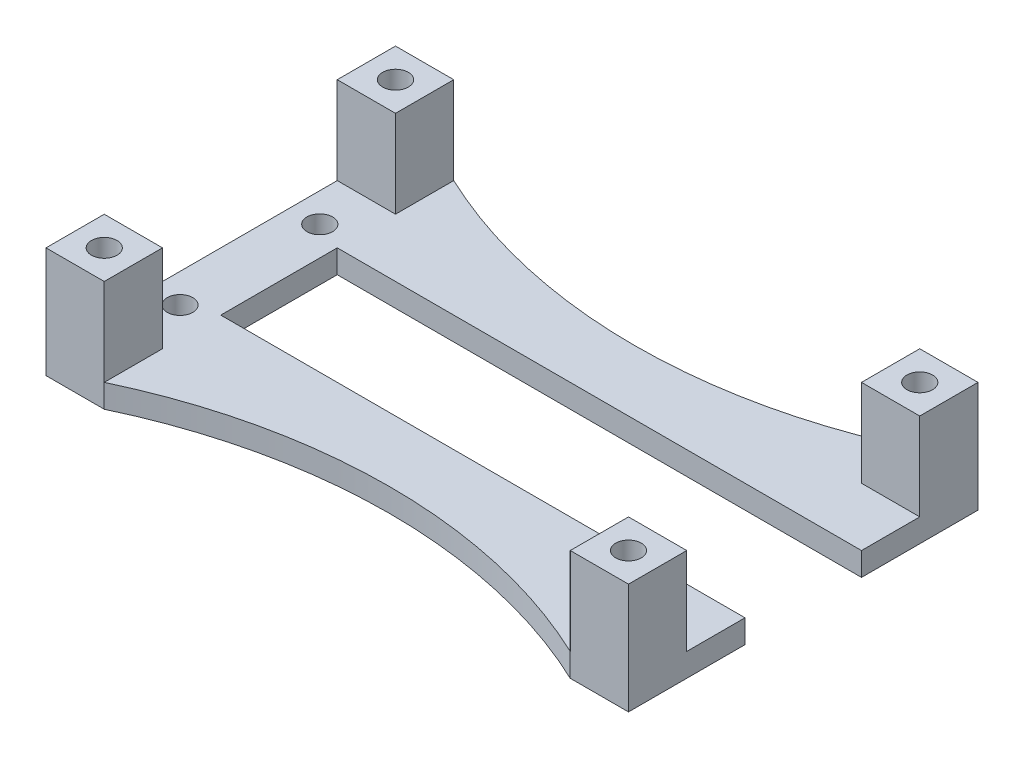
ISO-10303-21;
HEADER;
FILE_DESCRIPTION(('STEP AP214'),'2;1');
FILE_NAME('part.step','',(''),(''),'','','');
FILE_SCHEMA(('AUTOMOTIVE_DESIGN { 1 0 10303 214 1 1 1 1 }'));
ENDSEC;
DATA;
#1=APPLICATION_CONTEXT('core data for automotive mechanical design processes');
#2=APPLICATION_PROTOCOL_DEFINITION('international standard','automotive_design',2000,#1);
#3=PRODUCT_CONTEXT('',#1,'mechanical');
#4=PRODUCT('Part','Part','',(#3));
#5=PRODUCT_RELATED_PRODUCT_CATEGORY('part','',(#4));
#6=PRODUCT_DEFINITION_FORMATION('','',#4);
#7=PRODUCT_DEFINITION_CONTEXT('part definition',#1,'design');
#8=PRODUCT_DEFINITION('design','',#6,#7);
#9=PRODUCT_DEFINITION_SHAPE('','',#8);
#10=(LENGTH_UNIT() NAMED_UNIT(*) SI_UNIT(.MILLI.,.METRE.));
#11=(NAMED_UNIT(*) PLANE_ANGLE_UNIT() SI_UNIT($,.RADIAN.));
#12=(NAMED_UNIT(*) SI_UNIT($,.STERADIAN.) SOLID_ANGLE_UNIT());
#13=UNCERTAINTY_MEASURE_WITH_UNIT(LENGTH_MEASURE(1.E-05),#10,'distance_accuracy_value','');
#14=(GEOMETRIC_REPRESENTATION_CONTEXT(3) GLOBAL_UNCERTAINTY_ASSIGNED_CONTEXT((#13)) GLOBAL_UNIT_ASSIGNED_CONTEXT((#10,
#11,#12)) REPRESENTATION_CONTEXT('',''));
#15=CARTESIAN_POINT('',(0.,0.,0.));
#16=DIRECTION('',(0.,0.,1.));
#17=DIRECTION('',(1.,0.,0.));
#18=AXIS2_PLACEMENT_3D('',#15,#16,#17);
#19=CARTESIAN_POINT('',(95.,4.,25.0000000000001));
#20=DIRECTION('',(0.,-1.,0.));
#21=DIRECTION('',(0.,0.,-1.));
#22=AXIS2_PLACEMENT_3D('',#19,#20,#21);
#23=CYLINDRICAL_SURFACE('',#22,2.2);
#24=CARTESIAN_POINT('',(95.,19.,25.0000000000001));
#25=DIRECTION('',(0.,1.,0.));
#26=DIRECTION('',(0.,0.,1.));
#27=AXIS2_PLACEMENT_3D('',#24,#25,#26);
#28=CIRCLE('',#27,2.2);
#29=CARTESIAN_POINT('',(95.,19.,27.2000000000001));
#30=VERTEX_POINT('',#29);
#31=EDGE_CURVE('E269',#30,#30,#28,.T.);
#32=ORIENTED_EDGE('',*,*,#31,.T.);
#33=EDGE_LOOP('',(#32));
#34=FACE_BOUND('',#33,.T.);
#35=CARTESIAN_POINT('',(95.,2.5,25.0000000000001));
#36=DIRECTION('',(0.,-1.,0.));
#37=DIRECTION('',(0.,0.,-1.));
#38=AXIS2_PLACEMENT_3D('',#35,#36,#37);
#39=CIRCLE('',#38,2.2);
#40=CARTESIAN_POINT('',(95.,2.5,22.8000000000001));
#41=VERTEX_POINT('',#40);
#42=EDGE_CURVE('E39',#41,#41,#39,.T.);
#43=ORIENTED_EDGE('',*,*,#42,.T.);
#44=EDGE_LOOP('',(#43));
#45=FACE_BOUND('',#44,.T.);
#46=ADVANCED_FACE('F35',(#34,#45),#23,.F.);
#47=CARTESIAN_POINT('',(5.,4.,-25.));
#48=DIRECTION('',(0.,-1.,0.));
#49=DIRECTION('',(0.,0.,-1.));
#50=AXIS2_PLACEMENT_3D('',#47,#48,#49);
#51=CYLINDRICAL_SURFACE('',#50,2.2);
#52=CARTESIAN_POINT('',(5.,19.,-25.));
#53=DIRECTION('',(0.,1.,0.));
#54=DIRECTION('',(0.,0.,1.));
#55=AXIS2_PLACEMENT_3D('',#52,#53,#54);
#56=CIRCLE('',#55,2.2);
#57=CARTESIAN_POINT('',(5.,19.,-22.8));
#58=VERTEX_POINT('',#57);
#59=EDGE_CURVE('E243',#58,#58,#56,.T.);
#60=ORIENTED_EDGE('',*,*,#59,.T.);
#61=EDGE_LOOP('',(#60));
#62=FACE_BOUND('',#61,.T.);
#63=CARTESIAN_POINT('',(5.,2.5,-25.));
#64=DIRECTION('',(0.,-1.,0.));
#65=DIRECTION('',(0.,0.,-1.));
#66=AXIS2_PLACEMENT_3D('',#63,#64,#65);
#67=CIRCLE('',#66,2.2);
#68=CARTESIAN_POINT('',(5.,2.5,-27.2));
#69=VERTEX_POINT('',#68);
#70=EDGE_CURVE('E388',#69,#69,#67,.T.);
#71=ORIENTED_EDGE('',*,*,#70,.T.);
#72=EDGE_LOOP('',(#71));
#73=FACE_BOUND('',#72,.T.);
#74=ADVANCED_FACE('F498',(#62,#73),#51,.F.);
#75=CARTESIAN_POINT('',(95.,4.,-25.));
#76=DIRECTION('',(0.,-1.,0.));
#77=DIRECTION('',(0.,0.,-1.));
#78=AXIS2_PLACEMENT_3D('',#75,#76,#77);
#79=CYLINDRICAL_SURFACE('',#78,2.2);
#80=CARTESIAN_POINT('',(95.,19.,-25.));
#81=DIRECTION('',(0.,1.,0.));
#82=DIRECTION('',(0.,0.,1.));
#83=AXIS2_PLACEMENT_3D('',#80,#81,#82);
#84=CIRCLE('',#83,2.20000000000001);
#85=CARTESIAN_POINT('',(95.,19.,-22.8));
#86=VERTEX_POINT('',#85);
#87=EDGE_CURVE('E393',#86,#86,#84,.T.);
#88=ORIENTED_EDGE('',*,*,#87,.T.);
#89=EDGE_LOOP('',(#88));
#90=FACE_BOUND('',#89,.T.);
#91=CARTESIAN_POINT('',(95.,2.5,-25.));
#92=DIRECTION('',(0.,-1.,0.));
#93=DIRECTION('',(0.,0.,-1.));
#94=AXIS2_PLACEMENT_3D('',#91,#92,#93);
#95=CIRCLE('',#94,2.2);
#96=CARTESIAN_POINT('',(95.,2.5,-27.2));
#97=VERTEX_POINT('',#96);
#98=EDGE_CURVE('E385',#97,#97,#95,.T.);
#99=ORIENTED_EDGE('',*,*,#98,.T.);
#100=EDGE_LOOP('',(#99));
#101=FACE_BOUND('',#100,.T.);
#102=ADVANCED_FACE('F503',(#90,#101),#79,.F.);
#103=CARTESIAN_POINT('',(5.,4.,25.));
#104=DIRECTION('',(0.,-1.,0.));
#105=DIRECTION('',(0.,0.,-1.));
#106=AXIS2_PLACEMENT_3D('',#103,#104,#105);
#107=CYLINDRICAL_SURFACE('',#106,2.2);
#108=CARTESIAN_POINT('',(5.,19.,25.));
#109=DIRECTION('',(0.,1.,0.));
#110=DIRECTION('',(0.,0.,1.));
#111=AXIS2_PLACEMENT_3D('',#108,#109,#110);
#112=CIRCLE('',#111,2.2);
#113=CARTESIAN_POINT('',(5.,19.,27.2));
#114=VERTEX_POINT('',#113);
#115=EDGE_CURVE('E208',#114,#114,#112,.T.);
#116=ORIENTED_EDGE('',*,*,#115,.T.);
#117=EDGE_LOOP('',(#116));
#118=FACE_BOUND('',#117,.T.);
#119=CARTESIAN_POINT('',(5.,2.5,25.));
#120=DIRECTION('',(0.,-1.,0.));
#121=DIRECTION('',(0.,0.,-1.));
#122=AXIS2_PLACEMENT_3D('',#119,#120,#121);
#123=CIRCLE('',#122,2.2);
#124=CARTESIAN_POINT('',(5.,2.5,22.8));
#125=VERTEX_POINT('',#124);
#126=EDGE_CURVE('E382',#125,#125,#123,.T.);
#127=ORIENTED_EDGE('',*,*,#126,.T.);
#128=EDGE_LOOP('',(#127));
#129=FACE_BOUND('',#128,.T.);
#130=ADVANCED_FACE('F507',(#118,#129),#107,.F.);
#131=CARTESIAN_POINT('',(0.,4.,0.));
#132=DIRECTION('',(0.,1.,0.));
#133=DIRECTION('',(0.,0.,1.));
#134=AXIS2_PLACEMENT_3D('',#131,#132,#133);
#135=PLANE('',#134);
#136=CARTESIAN_POINT('',(5.,4.,-12.));
#137=DIRECTION('',(0.,1.,0.));
#138=DIRECTION('',(0.,0.,1.));
#139=AXIS2_PLACEMENT_3D('',#136,#137,#138);
#140=CIRCLE('',#139,2.2);
#141=CARTESIAN_POINT('',(5.,4.,-9.8));
#142=VERTEX_POINT('',#141);
#143=EDGE_CURVE('E320',#142,#142,#140,.F.);
#144=ORIENTED_EDGE('',*,*,#143,.T.);
#145=EDGE_LOOP('',(#144));
#146=FACE_BOUND('',#145,.T.);
#147=CARTESIAN_POINT('',(5.,4.,12.));
#148=DIRECTION('',(0.,1.,0.));
#149=DIRECTION('',(0.,0.,1.));
#150=AXIS2_PLACEMENT_3D('',#147,#148,#149);
#151=CIRCLE('',#150,2.2);
#152=CARTESIAN_POINT('',(5.,4.,14.2));
#153=VERTEX_POINT('',#152);
#154=EDGE_CURVE('E317',#153,#153,#151,.T.);
#155=ORIENTED_EDGE('',*,*,#154,.F.);
#156=EDGE_LOOP('',(#155));
#157=FACE_BOUND('',#156,.T.);
#158=DIRECTION('',(0.,0.,-1.));
#159=VECTOR('',#158,1.);
#160=CARTESIAN_POINT('',(100.,4.,-2.77555756156289E-13));
#161=LINE('',#160,#159);
#162=CARTESIAN_POINT('',(100.,4.,-10.));
#163=VERTEX_POINT('',#162);
#164=CARTESIAN_POINT('',(100.,4.,-20.));
#165=VERTEX_POINT('',#164);
#166=EDGE_CURVE('E57',#163,#165,#161,.T.);
#167=ORIENTED_EDGE('',*,*,#166,.T.);
#168=DIRECTION('',(1.,0.,0.));
#169=VECTOR('',#168,1.);
#170=CARTESIAN_POINT('',(90.,4.,-20.));
#171=LINE('',#170,#169);
#172=CARTESIAN_POINT('',(90.,4.,-20.));
#173=VERTEX_POINT('',#172);
#174=EDGE_CURVE('E52',#173,#165,#171,.T.);
#175=ORIENTED_EDGE('',*,*,#174,.F.);
#176=DIRECTION('',(0.,0.,1.));
#177=VECTOR('',#176,1.);
#178=CARTESIAN_POINT('',(90.,4.,-30.));
#179=LINE('',#178,#177);
#180=CARTESIAN_POINT('',(90.,4.,-30.));
#181=VERTEX_POINT('',#180);
#182=EDGE_CURVE('E205',#181,#173,#179,.T.);
#183=ORIENTED_EDGE('',*,*,#182,.F.);
#184=CARTESIAN_POINT('',(50.,4.,-114.388888888889));
#185=DIRECTION('',(0.,1.,0.));
#186=DIRECTION('',(0.,0.,1.));
#187=AXIS2_PLACEMENT_3D('',#184,#185,#186);
#188=CIRCLE('',#187,93.388888888889);
#189=CARTESIAN_POINT('',(10.,4.,-30.));
#190=VERTEX_POINT('',#189);
#191=EDGE_CURVE('E315',#190,#181,#188,.T.);
#192=ORIENTED_EDGE('',*,*,#191,.F.);
#193=DIRECTION('',(0.,0.,-1.));
#194=VECTOR('',#193,1.);
#195=CARTESIAN_POINT('',(10.,4.,-20.));
#196=LINE('',#195,#194);
#197=CARTESIAN_POINT('',(10.,4.,-20.));
#198=VERTEX_POINT('',#197);
#199=EDGE_CURVE('E251',#198,#190,#196,.T.);
#200=ORIENTED_EDGE('',*,*,#199,.F.);
#201=DIRECTION('',(1.,0.,0.));
#202=VECTOR('',#201,1.);
#203=CARTESIAN_POINT('',(0.,4.,-20.));
#204=LINE('',#203,#202);
#205=CARTESIAN_POINT('',(0.,4.,-20.));
#206=VERTEX_POINT('',#205);
#207=EDGE_CURVE('E246',#206,#198,#204,.T.);
#208=ORIENTED_EDGE('',*,*,#207,.F.);
#209=DIRECTION('',(0.,0.,-1.));
#210=VECTOR('',#209,1.);
#211=CARTESIAN_POINT('',(0.,4.,0.));
#212=LINE('',#211,#210);
#213=CARTESIAN_POINT('',(0.,4.,20.));
#214=VERTEX_POINT('',#213);
#215=EDGE_CURVE('E298',#214,#206,#212,.T.);
#216=ORIENTED_EDGE('',*,*,#215,.F.);
#217=DIRECTION('',(-1.,0.,0.));
#218=VECTOR('',#217,1.);
#219=CARTESIAN_POINT('',(10.,4.,20.));
#220=LINE('',#219,#218);
#221=CARTESIAN_POINT('',(10.,4.,20.));
#222=VERTEX_POINT('',#221);
#223=EDGE_CURVE('E223',#222,#214,#220,.T.);
#224=ORIENTED_EDGE('',*,*,#223,.F.);
#225=DIRECTION('',(0.,0.,-1.));
#226=VECTOR('',#225,1.);
#227=CARTESIAN_POINT('',(10.,4.,30.));
#228=LINE('',#227,#226);
#229=CARTESIAN_POINT('',(10.,4.,30.));
#230=VERTEX_POINT('',#229);
#231=EDGE_CURVE('E212',#230,#222,#228,.T.);
#232=ORIENTED_EDGE('',*,*,#231,.F.);
#233=CARTESIAN_POINT('',(50.,4.,114.388888888889));
#234=DIRECTION('',(0.,1.,0.));
#235=DIRECTION('',(0.,0.,1.));
#236=AXIS2_PLACEMENT_3D('',#233,#234,#235);
#237=CIRCLE('',#236,93.3888888888889);
#238=CARTESIAN_POINT('',(90.,4.,30.));
#239=VERTEX_POINT('',#238);
#240=EDGE_CURVE('E300',#239,#230,#237,.T.);
#241=ORIENTED_EDGE('',*,*,#240,.F.);
#242=DIRECTION('',(0.,0.,1.));
#243=VECTOR('',#242,1.);
#244=CARTESIAN_POINT('',(90.,4.,30.0000000000001));
#245=LINE('',#244,#243);
#246=CARTESIAN_POINT('',(90.,4.,20.0000000000001));
#247=VERTEX_POINT('',#246);
#248=EDGE_CURVE('E272',#247,#239,#245,.T.);
#249=ORIENTED_EDGE('',*,*,#248,.F.);
#250=DIRECTION('',(-1.,0.,0.));
#251=VECTOR('',#250,1.);
#252=CARTESIAN_POINT('',(90.,4.,20.0000000000001));
#253=LINE('',#252,#251);
#254=CARTESIAN_POINT('',(100.,4.,20.0000000000001));
#255=VERTEX_POINT('',#254);
#256=EDGE_CURVE('E277',#255,#247,#253,.T.);
#257=ORIENTED_EDGE('',*,*,#256,.F.);
#258=DIRECTION('',(0.,0.,-1.));
#259=VECTOR('',#258,1.);
#260=CARTESIAN_POINT('',(100.,4.,1.38777878078145E-13));
#261=LINE('',#260,#259);
#262=CARTESIAN_POINT('',(100.,4.,10.));
#263=VERTEX_POINT('',#262);
#264=EDGE_CURVE('E303',#255,#263,#261,.T.);
#265=ORIENTED_EDGE('',*,*,#264,.T.);
#266=DIRECTION('',(1.,0.,0.));
#267=VECTOR('',#266,1.);
#268=CARTESIAN_POINT('',(0.,4.,9.99999999999988));
#269=LINE('',#268,#267);
#270=CARTESIAN_POINT('',(10.,4.,10.));
#271=VERTEX_POINT('',#270);
#272=EDGE_CURVE('E305',#271,#263,#269,.T.);
#273=ORIENTED_EDGE('',*,*,#272,.F.);
#274=DIRECTION('',(0.,0.,1.));
#275=VECTOR('',#274,1.);
#276=CARTESIAN_POINT('',(10.,4.,0.));
#277=LINE('',#276,#275);
#278=CARTESIAN_POINT('',(10.,4.,-9.99999999999999));
#279=VERTEX_POINT('',#278);
#280=EDGE_CURVE('E308',#279,#271,#277,.T.);
#281=ORIENTED_EDGE('',*,*,#280,.F.);
#282=DIRECTION('',(-1.,0.,0.));
#283=VECTOR('',#282,1.);
#284=CARTESIAN_POINT('',(0.,4.,-9.99999999999999));
#285=LINE('',#284,#283);
#286=EDGE_CURVE('E311',#163,#279,#285,.T.);
#287=ORIENTED_EDGE('',*,*,#286,.F.);
#288=EDGE_LOOP('',(#167,#175,#183,#192,#200,#208,#216,#224,#232,#241,#249,#257,#265,#273,#281,#287));
#289=FACE_BOUND('',#288,.T.);
#290=ADVANCED_FACE('F411',(#146,#157,#289),#135,.T.);
#291=CARTESIAN_POINT('',(0.,4.,0.));
#292=DIRECTION('',(-1.,0.,0.));
#293=DIRECTION('',(0.,0.,1.));
#294=AXIS2_PLACEMENT_3D('',#291,#292,#293);
#295=PLANE('',#294);
#296=DIRECTION('',(0.,0.,-1.));
#297=VECTOR('',#296,1.);
#298=CARTESIAN_POINT('',(0.,0.,0.));
#299=LINE('',#298,#297);
#300=CARTESIAN_POINT('',(0.,0.,30.));
#301=VERTEX_POINT('',#300);
#302=CARTESIAN_POINT('',(0.,0.,-30.));
#303=VERTEX_POINT('',#302);
#304=EDGE_CURVE('E297',#301,#303,#299,.T.);
#305=ORIENTED_EDGE('',*,*,#304,.F.);
#306=DIRECTION('',(0.,-1.,0.));
#307=VECTOR('',#306,1.);
#308=CARTESIAN_POINT('',(0.,4.,30.));
#309=LINE('',#308,#307);
#310=CARTESIAN_POINT('',(0.,19.,30.));
#311=VERTEX_POINT('',#310);
#312=EDGE_CURVE('E11',#311,#301,#309,.T.);
#313=ORIENTED_EDGE('',*,*,#312,.F.);
#314=DIRECTION('',(0.,0.,1.));
#315=VECTOR('',#314,1.);
#316=CARTESIAN_POINT('',(0.,19.,20.));
#317=LINE('',#316,#315);
#318=CARTESIAN_POINT('',(0.,19.,20.));
#319=VERTEX_POINT('',#318);
#320=EDGE_CURVE('E225',#319,#311,#317,.T.);
#321=ORIENTED_EDGE('',*,*,#320,.F.);
#322=DIRECTION('',(0.,-1.,0.));
#323=VECTOR('',#322,1.);
#324=CARTESIAN_POINT('',(0.,19.,20.));
#325=LINE('',#324,#323);
#326=EDGE_CURVE('E237',#319,#214,#325,.T.);
#327=ORIENTED_EDGE('',*,*,#326,.T.);
#328=ORIENTED_EDGE('',*,*,#215,.T.);
#329=DIRECTION('',(0.,-1.,0.));
#330=VECTOR('',#329,1.);
#331=CARTESIAN_POINT('',(0.,19.,-20.));
#332=LINE('',#331,#330);
#333=CARTESIAN_POINT('',(0.,19.,-20.));
#334=VERTEX_POINT('',#333);
#335=EDGE_CURVE('E258',#334,#206,#332,.T.);
#336=ORIENTED_EDGE('',*,*,#335,.F.);
#337=DIRECTION('',(0.,0.,1.));
#338=VECTOR('',#337,1.);
#339=CARTESIAN_POINT('',(0.,19.,-30.));
#340=LINE('',#339,#338);
#341=CARTESIAN_POINT('',(0.,19.,-30.));
#342=VERTEX_POINT('',#341);
#343=EDGE_CURVE('E256',#342,#334,#340,.T.);
#344=ORIENTED_EDGE('',*,*,#343,.F.);
#345=DIRECTION('',(0.,-1.,0.));
#346=VECTOR('',#345,1.);
#347=CARTESIAN_POINT('',(0.,4.,-30.));
#348=LINE('',#347,#346);
#349=EDGE_CURVE('E323',#342,#303,#348,.T.);
#350=ORIENTED_EDGE('',*,*,#349,.T.);
#351=EDGE_LOOP('',(#305,#313,#321,#327,#328,#336,#344,#350));
#352=FACE_BOUND('',#351,.T.);
#353=ADVANCED_FACE('F37',(#352),#295,.T.);
#354=CARTESIAN_POINT('',(0.,4.,30.));
#355=DIRECTION('',(0.,0.,-1.));
#356=DIRECTION('',(-1.,0.,0.));
#357=AXIS2_PLACEMENT_3D('',#354,#355,#356);
#358=PLANE('',#357);
#359=DIRECTION('',(1.,0.,0.));
#360=VECTOR('',#359,1.);
#361=CARTESIAN_POINT('',(0.,0.,30.));
#362=LINE('',#361,#360);
#363=CARTESIAN_POINT('',(10.,0.,30.));
#364=VERTEX_POINT('',#363);
#365=EDGE_CURVE('E326',#301,#364,#362,.T.);
#366=ORIENTED_EDGE('',*,*,#365,.T.);
#367=DIRECTION('',(0.,-1.,0.));
#368=VECTOR('',#367,1.);
#369=CARTESIAN_POINT('',(10.,4.,30.));
#370=LINE('',#369,#368);
#371=EDGE_CURVE('E44',#230,#364,#370,.T.);
#372=ORIENTED_EDGE('',*,*,#371,.F.);
#373=DIRECTION('',(0.,-1.,0.));
#374=VECTOR('',#373,1.);
#375=CARTESIAN_POINT('',(10.,19.,30.));
#376=LINE('',#375,#374);
#377=CARTESIAN_POINT('',(10.,19.,30.));
#378=VERTEX_POINT('',#377);
#379=EDGE_CURVE('E230',#378,#230,#376,.T.);
#380=ORIENTED_EDGE('',*,*,#379,.F.);
#381=DIRECTION('',(1.,0.,0.));
#382=VECTOR('',#381,1.);
#383=CARTESIAN_POINT('',(0.,19.,30.));
#384=LINE('',#383,#382);
#385=EDGE_CURVE('E228',#311,#378,#384,.T.);
#386=ORIENTED_EDGE('',*,*,#385,.F.);
#387=ORIENTED_EDGE('',*,*,#312,.T.);
#388=EDGE_LOOP('',(#366,#372,#380,#386,#387));
#389=FACE_BOUND('',#388,.T.);
#390=ADVANCED_FACE('F453',(#389),#358,.F.);
#391=CARTESIAN_POINT('',(50.,4.,114.388888888889));
#392=DIRECTION('',(0.,-1.,0.));
#393=DIRECTION('',(0.,0.,-1.));
#394=AXIS2_PLACEMENT_3D('',#391,#392,#393);
#395=CYLINDRICAL_SURFACE('',#394,93.3888888888889);
#396=CARTESIAN_POINT('',(50.,0.,114.388888888889));
#397=DIRECTION('',(0.,1.,0.));
#398=DIRECTION('',(0.,0.,1.));
#399=AXIS2_PLACEMENT_3D('',#396,#397,#398);
#400=CIRCLE('',#399,93.3888888888889);
#401=CARTESIAN_POINT('',(90.,0.,30.));
#402=VERTEX_POINT('',#401);
#403=EDGE_CURVE('E329',#402,#364,#400,.T.);
#404=ORIENTED_EDGE('',*,*,#403,.F.);
#405=DIRECTION('',(0.,-1.,0.));
#406=VECTOR('',#405,1.);
#407=CARTESIAN_POINT('',(90.,4.,30.));
#408=LINE('',#407,#406);
#409=EDGE_CURVE('E379',#239,#402,#408,.T.);
#410=ORIENTED_EDGE('',*,*,#409,.F.);
#411=ORIENTED_EDGE('',*,*,#240,.T.);
#412=ORIENTED_EDGE('',*,*,#371,.T.);
#413=EDGE_LOOP('',(#404,#410,#411,#412));
#414=FACE_BOUND('',#413,.T.);
#415=ADVANCED_FACE('F538',(#414),#395,.F.);
#416=CARTESIAN_POINT('',(-3.74700270810977E-13,4.,29.9999999999989));
#417=DIRECTION('',(0.,0.,1.));
#418=DIRECTION('',(1.,0.,0.));
#419=AXIS2_PLACEMENT_3D('',#416,#417,#418);
#420=PLANE('',#419);
#421=DIRECTION('',(-1.,0.,0.));
#422=VECTOR('',#421,1.);
#423=CARTESIAN_POINT('',(-3.74700270810977E-13,0.,29.9999999999989));
#424=LINE('',#423,#422);
#425=CARTESIAN_POINT('',(100.,0.,30.0000000000001));
#426=VERTEX_POINT('',#425);
#427=EDGE_CURVE('E332',#426,#402,#424,.T.);
#428=ORIENTED_EDGE('',*,*,#427,.F.);
#429=DIRECTION('',(0.,-1.,0.));
#430=VECTOR('',#429,1.);
#431=CARTESIAN_POINT('',(100.,4.,30.0000000000001));
#432=LINE('',#431,#430);
#433=CARTESIAN_POINT('',(100.,19.,30.0000000000001));
#434=VERTEX_POINT('',#433);
#435=EDGE_CURVE('E377',#434,#426,#432,.T.);
#436=ORIENTED_EDGE('',*,*,#435,.F.);
#437=DIRECTION('',(1.,0.,0.));
#438=VECTOR('',#437,1.);
#439=CARTESIAN_POINT('',(100.,19.,30.0000000000001));
#440=LINE('',#439,#438);
#441=CARTESIAN_POINT('',(90.,19.,30.0000000000001));
#442=VERTEX_POINT('',#441);
#443=EDGE_CURVE('E276',#442,#434,#440,.T.);
#444=ORIENTED_EDGE('',*,*,#443,.F.);
#445=DIRECTION('',(0.,-1.,0.));
#446=VECTOR('',#445,1.);
#447=CARTESIAN_POINT('',(90.,19.,30.0000000000001));
#448=LINE('',#447,#446);
#449=EDGE_CURVE('E294',#442,#239,#448,.T.);
#450=ORIENTED_EDGE('',*,*,#449,.T.);
#451=ORIENTED_EDGE('',*,*,#409,.T.);
#452=EDGE_LOOP('',(#428,#436,#444,#450,#451));
#453=FACE_BOUND('',#452,.T.);
#454=ADVANCED_FACE('F463',(#453),#420,.T.);
#455=CARTESIAN_POINT('',(100.,4.,1.38777878078145E-13));
#456=DIRECTION('',(-1.,0.,0.));
#457=DIRECTION('',(0.,0.,1.));
#458=AXIS2_PLACEMENT_3D('',#455,#456,#457);
#459=PLANE('',#458);
#460=DIRECTION('',(0.,0.,-1.));
#461=VECTOR('',#460,1.);
#462=CARTESIAN_POINT('',(100.,0.,1.38777878078145E-13));
#463=LINE('',#462,#461);
#464=CARTESIAN_POINT('',(100.,0.,10.));
#465=VERTEX_POINT('',#464);
#466=EDGE_CURVE('E335',#426,#465,#463,.T.);
#467=ORIENTED_EDGE('',*,*,#466,.T.);
#468=DIRECTION('',(0.,-1.,0.));
#469=VECTOR('',#468,1.);
#470=CARTESIAN_POINT('',(100.,4.,10.));
#471=LINE('',#470,#469);
#472=EDGE_CURVE('E375',#263,#465,#471,.T.);
#473=ORIENTED_EDGE('',*,*,#472,.F.);
#474=ORIENTED_EDGE('',*,*,#264,.F.);
#475=DIRECTION('',(0.,-1.,0.));
#476=VECTOR('',#475,1.);
#477=CARTESIAN_POINT('',(100.,19.,20.0000000000001));
#478=LINE('',#477,#476);
#479=CARTESIAN_POINT('',(100.,19.,20.0000000000001));
#480=VERTEX_POINT('',#479);
#481=EDGE_CURVE('E291',#480,#255,#478,.T.);
#482=ORIENTED_EDGE('',*,*,#481,.F.);
#483=DIRECTION('',(0.,0.,-1.));
#484=VECTOR('',#483,1.);
#485=CARTESIAN_POINT('',(100.,19.,20.0000000000001));
#486=LINE('',#485,#484);
#487=EDGE_CURVE('E280',#434,#480,#486,.T.);
#488=ORIENTED_EDGE('',*,*,#487,.F.);
#489=ORIENTED_EDGE('',*,*,#435,.T.);
#490=EDGE_LOOP('',(#467,#473,#474,#482,#488,#489));
#491=FACE_BOUND('',#490,.T.);
#492=ADVANCED_FACE('F477',(#491),#459,.F.);
#493=CARTESIAN_POINT('',(0.,4.,9.99999999999988));
#494=DIRECTION('',(0.,0.,-1.));
#495=DIRECTION('',(-1.,0.,0.));
#496=AXIS2_PLACEMENT_3D('',#493,#494,#495);
#497=PLANE('',#496);
#498=DIRECTION('',(1.,0.,0.));
#499=VECTOR('',#498,1.);
#500=CARTESIAN_POINT('',(0.,0.,9.99999999999988));
#501=LINE('',#500,#499);
#502=CARTESIAN_POINT('',(10.,0.,10.));
#503=VERTEX_POINT('',#502);
#504=EDGE_CURVE('E338',#503,#465,#501,.T.);
#505=ORIENTED_EDGE('',*,*,#504,.F.);
#506=DIRECTION('',(0.,-1.,0.));
#507=VECTOR('',#506,1.);
#508=CARTESIAN_POINT('',(10.,4.,10.));
#509=LINE('',#508,#507);
#510=EDGE_CURVE('E373',#271,#503,#509,.T.);
#511=ORIENTED_EDGE('',*,*,#510,.F.);
#512=ORIENTED_EDGE('',*,*,#272,.T.);
#513=ORIENTED_EDGE('',*,*,#472,.T.);
#514=EDGE_LOOP('',(#505,#511,#512,#513));
#515=FACE_BOUND('',#514,.T.);
#516=ADVANCED_FACE('F482',(#515),#497,.T.);
#517=CARTESIAN_POINT('',(10.,4.,0.));
#518=DIRECTION('',(1.,0.,0.));
#519=DIRECTION('',(0.,0.,-1.));
#520=AXIS2_PLACEMENT_3D('',#517,#518,#519);
#521=PLANE('',#520);
#522=DIRECTION('',(0.,0.,1.));
#523=VECTOR('',#522,1.);
#524=CARTESIAN_POINT('',(10.,0.,0.));
#525=LINE('',#524,#523);
#526=CARTESIAN_POINT('',(10.,0.,-9.99999999999999));
#527=VERTEX_POINT('',#526);
#528=EDGE_CURVE('E341',#527,#503,#525,.T.);
#529=ORIENTED_EDGE('',*,*,#528,.F.);
#530=DIRECTION('',(0.,-1.,0.));
#531=VECTOR('',#530,1.);
#532=CARTESIAN_POINT('',(10.,4.,-9.99999999999999));
#533=LINE('',#532,#531);
#534=EDGE_CURVE('E371',#279,#527,#533,.T.);
#535=ORIENTED_EDGE('',*,*,#534,.F.);
#536=ORIENTED_EDGE('',*,*,#280,.T.);
#537=ORIENTED_EDGE('',*,*,#510,.T.);
#538=EDGE_LOOP('',(#529,#535,#536,#537));
#539=FACE_BOUND('',#538,.T.);
#540=ADVANCED_FACE('F486',(#539),#521,.T.);
#541=CARTESIAN_POINT('',(0.,4.,-9.99999999999999));
#542=DIRECTION('',(0.,0.,1.));
#543=DIRECTION('',(1.,0.,0.));
#544=AXIS2_PLACEMENT_3D('',#541,#542,#543);
#545=PLANE('',#544);
#546=DIRECTION('',(-1.,0.,0.));
#547=VECTOR('',#546,1.);
#548=CARTESIAN_POINT('',(0.,0.,-9.99999999999999));
#549=LINE('',#548,#547);
#550=CARTESIAN_POINT('',(100.,0.,-10.));
#551=VERTEX_POINT('',#550);
#552=EDGE_CURVE('E344',#551,#527,#549,.T.);
#553=ORIENTED_EDGE('',*,*,#552,.F.);
#554=DIRECTION('',(0.,-1.,0.));
#555=VECTOR('',#554,1.);
#556=CARTESIAN_POINT('',(100.,4.,-10.));
#557=LINE('',#556,#555);
#558=EDGE_CURVE('E369',#163,#551,#557,.T.);
#559=ORIENTED_EDGE('',*,*,#558,.F.);
#560=ORIENTED_EDGE('',*,*,#286,.T.);
#561=ORIENTED_EDGE('',*,*,#534,.T.);
#562=EDGE_LOOP('',(#553,#559,#560,#561));
#563=FACE_BOUND('',#562,.T.);
#564=ADVANCED_FACE('F489',(#563),#545,.T.);
#565=CARTESIAN_POINT('',(100.,4.,-2.77555756156289E-13));
#566=DIRECTION('',(-1.,0.,0.));
#567=DIRECTION('',(0.,0.,1.));
#568=AXIS2_PLACEMENT_3D('',#565,#566,#567);
#569=PLANE('',#568);
#570=DIRECTION('',(0.,0.,-1.));
#571=VECTOR('',#570,1.);
#572=CARTESIAN_POINT('',(100.,0.,-2.77555756156289E-13));
#573=LINE('',#572,#571);
#574=CARTESIAN_POINT('',(100.,0.,-30.));
#575=VERTEX_POINT('',#574);
#576=EDGE_CURVE('E347',#551,#575,#573,.T.);
#577=ORIENTED_EDGE('',*,*,#576,.T.);
#578=DIRECTION('',(0.,-1.,0.));
#579=VECTOR('',#578,1.);
#580=CARTESIAN_POINT('',(100.,4.,-30.));
#581=LINE('',#580,#579);
#582=CARTESIAN_POINT('',(100.,19.,-30.));
#583=VERTEX_POINT('',#582);
#584=EDGE_CURVE('E191',#583,#575,#581,.T.);
#585=ORIENTED_EDGE('',*,*,#584,.F.);
#586=DIRECTION('',(0.,0.,-1.));
#587=VECTOR('',#586,1.);
#588=CARTESIAN_POINT('',(100.,19.,-20.));
#589=LINE('',#588,#587);
#590=CARTESIAN_POINT('',(100.,19.,-20.));
#591=VERTEX_POINT('',#590);
#592=EDGE_CURVE('E185',#591,#583,#589,.T.);
#593=ORIENTED_EDGE('',*,*,#592,.F.);
#594=DIRECTION('',(0.,-1.,0.));
#595=VECTOR('',#594,1.);
#596=CARTESIAN_POINT('',(100.,19.,-20.));
#597=LINE('',#596,#595);
#598=EDGE_CURVE('E189',#591,#165,#597,.T.);
#599=ORIENTED_EDGE('',*,*,#598,.T.);
#600=ORIENTED_EDGE('',*,*,#166,.F.);
#601=ORIENTED_EDGE('',*,*,#558,.T.);
#602=EDGE_LOOP('',(#577,#585,#593,#599,#600,#601));
#603=FACE_BOUND('',#602,.T.);
#604=ADVANCED_FACE('F187',(#603),#569,.F.);
#605=CARTESIAN_POINT('',(0.,4.,-30.));
#606=DIRECTION('',(0.,0.,1.));
#607=DIRECTION('',(1.,0.,0.));
#608=AXIS2_PLACEMENT_3D('',#605,#606,#607);
#609=PLANE('',#608);
#610=DIRECTION('',(-1.,0.,0.));
#611=VECTOR('',#610,1.);
#612=CARTESIAN_POINT('',(0.,0.,-30.));
#613=LINE('',#612,#611);
#614=CARTESIAN_POINT('',(90.,0.,-30.));
#615=VERTEX_POINT('',#614);
#616=EDGE_CURVE('E349',#575,#615,#613,.T.);
#617=ORIENTED_EDGE('',*,*,#616,.T.);
#618=DIRECTION('',(0.,-1.,0.));
#619=VECTOR('',#618,1.);
#620=CARTESIAN_POINT('',(90.,4.,-30.));
#621=LINE('',#620,#619);
#622=EDGE_CURVE('E366',#181,#615,#621,.T.);
#623=ORIENTED_EDGE('',*,*,#622,.F.);
#624=DIRECTION('',(0.,-1.,0.));
#625=VECTOR('',#624,1.);
#626=CARTESIAN_POINT('',(90.,19.,-30.));
#627=LINE('',#626,#625);
#628=CARTESIAN_POINT('',(90.,19.,-30.));
#629=VERTEX_POINT('',#628);
#630=EDGE_CURVE('E209',#629,#181,#627,.T.);
#631=ORIENTED_EDGE('',*,*,#630,.F.);
#632=DIRECTION('',(-1.,0.,0.));
#633=VECTOR('',#632,1.);
#634=CARTESIAN_POINT('',(100.,19.,-30.));
#635=LINE('',#634,#633);
#636=EDGE_CURVE('E194',#583,#629,#635,.T.);
#637=ORIENTED_EDGE('',*,*,#636,.F.);
#638=ORIENTED_EDGE('',*,*,#584,.T.);
#639=EDGE_LOOP('',(#617,#623,#631,#637,#638));
#640=FACE_BOUND('',#639,.T.);
#641=ADVANCED_FACE('F420',(#640),#609,.F.);
#642=CARTESIAN_POINT('',(50.,4.,-114.388888888889));
#643=DIRECTION('',(0.,-1.,0.));
#644=DIRECTION('',(0.,0.,-1.));
#645=AXIS2_PLACEMENT_3D('',#642,#643,#644);
#646=CYLINDRICAL_SURFACE('',#645,93.388888888889);
#647=CARTESIAN_POINT('',(50.,0.,-114.388888888889));
#648=DIRECTION('',(0.,1.,0.));
#649=DIRECTION('',(0.,0.,1.));
#650=AXIS2_PLACEMENT_3D('',#647,#648,#649);
#651=CIRCLE('',#650,93.388888888889);
#652=CARTESIAN_POINT('',(10.,0.,-30.));
#653=VERTEX_POINT('',#652);
#654=EDGE_CURVE('E352',#653,#615,#651,.T.);
#655=ORIENTED_EDGE('',*,*,#654,.F.);
#656=DIRECTION('',(0.,-1.,0.));
#657=VECTOR('',#656,1.);
#658=CARTESIAN_POINT('',(10.,4.,-30.));
#659=LINE('',#658,#657);
#660=EDGE_CURVE('E364',#190,#653,#659,.T.);
#661=ORIENTED_EDGE('',*,*,#660,.F.);
#662=ORIENTED_EDGE('',*,*,#191,.T.);
#663=ORIENTED_EDGE('',*,*,#622,.T.);
#664=EDGE_LOOP('',(#655,#661,#662,#663));
#665=FACE_BOUND('',#664,.T.);
#666=ADVANCED_FACE('F418',(#665),#646,.F.);
#667=CARTESIAN_POINT('',(5.,4.,-12.));
#668=DIRECTION('',(0.,-1.,0.));
#669=DIRECTION('',(0.,0.,-1.));
#670=AXIS2_PLACEMENT_3D('',#667,#668,#669);
#671=CYLINDRICAL_SURFACE('',#670,2.2);
#672=ORIENTED_EDGE('',*,*,#143,.F.);
#673=EDGE_LOOP('',(#672));
#674=FACE_BOUND('',#673,.T.);
#675=CARTESIAN_POINT('',(5.,0.,-12.));
#676=DIRECTION('',(0.,1.,0.));
#677=DIRECTION('',(0.,0.,1.));
#678=AXIS2_PLACEMENT_3D('',#675,#676,#677);
#679=CIRCLE('',#678,2.2);
#680=CARTESIAN_POINT('',(5.,0.,-9.8));
#681=VERTEX_POINT('',#680);
#682=EDGE_CURVE('E301',#681,#681,#679,.F.);
#683=ORIENTED_EDGE('',*,*,#682,.T.);
#684=EDGE_LOOP('',(#683));
#685=FACE_BOUND('',#684,.T.);
#686=ADVANCED_FACE('F512',(#674,#685),#671,.F.);
#687=CARTESIAN_POINT('',(5.,4.,12.));
#688=DIRECTION('',(0.,-1.,0.));
#689=DIRECTION('',(0.,0.,-1.));
#690=AXIS2_PLACEMENT_3D('',#687,#688,#689);
#691=CYLINDRICAL_SURFACE('',#690,2.2);
#692=ORIENTED_EDGE('',*,*,#154,.T.);
#693=EDGE_LOOP('',(#692));
#694=FACE_BOUND('',#693,.T.);
#695=CARTESIAN_POINT('',(5.,0.,12.));
#696=DIRECTION('',(0.,1.,0.));
#697=DIRECTION('',(0.,0.,1.));
#698=AXIS2_PLACEMENT_3D('',#695,#696,#697);
#699=CIRCLE('',#698,2.2);
#700=CARTESIAN_POINT('',(5.,0.,14.2));
#701=VERTEX_POINT('',#700);
#702=EDGE_CURVE('E358',#701,#701,#699,.T.);
#703=ORIENTED_EDGE('',*,*,#702,.F.);
#704=EDGE_LOOP('',(#703));
#705=FACE_BOUND('',#704,.T.);
#706=ADVANCED_FACE('F515',(#694,#705),#691,.F.);
#707=CARTESIAN_POINT('',(0.,4.,-30.));
#708=DIRECTION('',(0.,0.,-1.));
#709=DIRECTION('',(-1.,0.,0.));
#710=AXIS2_PLACEMENT_3D('',#707,#708,#709);
#711=PLANE('',#710);
#712=DIRECTION('',(1.,0.,0.));
#713=VECTOR('',#712,1.);
#714=CARTESIAN_POINT('',(0.,0.,-30.));
#715=LINE('',#714,#713);
#716=EDGE_CURVE('E355',#303,#653,#715,.T.);
#717=ORIENTED_EDGE('',*,*,#716,.F.);
#718=ORIENTED_EDGE('',*,*,#349,.F.);
#719=DIRECTION('',(-1.,0.,0.));
#720=VECTOR('',#719,1.);
#721=CARTESIAN_POINT('',(10.,19.,-30.));
#722=LINE('',#721,#720);
#723=CARTESIAN_POINT('',(10.,19.,-30.));
#724=VERTEX_POINT('',#723);
#725=EDGE_CURVE('E253',#724,#342,#722,.T.);
#726=ORIENTED_EDGE('',*,*,#725,.F.);
#727=DIRECTION('',(0.,-1.,0.));
#728=VECTOR('',#727,1.);
#729=CARTESIAN_POINT('',(10.,19.,-30.));
#730=LINE('',#729,#728);
#731=EDGE_CURVE('E264',#724,#190,#730,.T.);
#732=ORIENTED_EDGE('',*,*,#731,.T.);
#733=ORIENTED_EDGE('',*,*,#660,.T.);
#734=EDGE_LOOP('',(#717,#718,#726,#732,#733));
#735=FACE_BOUND('',#734,.T.);
#736=ADVANCED_FACE('F430',(#735),#711,.T.);
#737=CARTESIAN_POINT('',(0.,0.,0.));
#738=DIRECTION('',(0.,1.,0.));
#739=DIRECTION('',(0.,0.,1.));
#740=AXIS2_PLACEMENT_3D('',#737,#738,#739);
#741=PLANE('',#740);
#742=CARTESIAN_POINT('',(95.,0.,-25.));
#743=DIRECTION('',(0.,-1.,0.));
#744=DIRECTION('',(0.,0.,-1.));
#745=AXIS2_PLACEMENT_3D('',#742,#743,#744);
#746=CIRCLE('',#745,4.215);
#747=CARTESIAN_POINT('',(95.,0.,-29.215));
#748=VERTEX_POINT('',#747);
#749=EDGE_CURVE('E563',#748,#748,#746,.T.);
#750=ORIENTED_EDGE('',*,*,#749,.F.);
#751=EDGE_LOOP('',(#750));
#752=FACE_BOUND('',#751,.T.);
#753=CARTESIAN_POINT('',(95.,0.,25.0000000000001));
#754=DIRECTION('',(0.,-1.,0.));
#755=DIRECTION('',(0.,0.,-1.));
#756=AXIS2_PLACEMENT_3D('',#753,#754,#755);
#757=CIRCLE('',#756,4.215);
#758=CARTESIAN_POINT('',(95.,0.,20.7850000000001));
#759=VERTEX_POINT('',#758);
#760=EDGE_CURVE('E567',#759,#759,#757,.T.);
#761=ORIENTED_EDGE('',*,*,#760,.F.);
#762=EDGE_LOOP('',(#761));
#763=FACE_BOUND('',#762,.T.);
#764=CARTESIAN_POINT('',(5.,0.,25.));
#765=DIRECTION('',(0.,-1.,0.));
#766=DIRECTION('',(0.,0.,-1.));
#767=AXIS2_PLACEMENT_3D('',#764,#765,#766);
#768=CIRCLE('',#767,4.215);
#769=CARTESIAN_POINT('',(5.,0.,20.785));
#770=VERTEX_POINT('',#769);
#771=EDGE_CURVE('E571',#770,#770,#768,.T.);
#772=ORIENTED_EDGE('',*,*,#771,.F.);
#773=EDGE_LOOP('',(#772));
#774=FACE_BOUND('',#773,.T.);
#775=CARTESIAN_POINT('',(5.,0.,-25.));
#776=DIRECTION('',(0.,-1.,0.));
#777=DIRECTION('',(0.,0.,-1.));
#778=AXIS2_PLACEMENT_3D('',#775,#776,#777);
#779=CIRCLE('',#778,4.215);
#780=CARTESIAN_POINT('',(5.,0.,-29.215));
#781=VERTEX_POINT('',#780);
#782=EDGE_CURVE('E402',#781,#781,#779,.T.);
#783=ORIENTED_EDGE('',*,*,#782,.F.);
#784=EDGE_LOOP('',(#783));
#785=FACE_BOUND('',#784,.T.);
#786=ORIENTED_EDGE('',*,*,#304,.T.);
#787=ORIENTED_EDGE('',*,*,#716,.T.);
#788=ORIENTED_EDGE('',*,*,#654,.T.);
#789=ORIENTED_EDGE('',*,*,#616,.F.);
#790=ORIENTED_EDGE('',*,*,#576,.F.);
#791=ORIENTED_EDGE('',*,*,#552,.T.);
#792=ORIENTED_EDGE('',*,*,#528,.T.);
#793=ORIENTED_EDGE('',*,*,#504,.T.);
#794=ORIENTED_EDGE('',*,*,#466,.F.);
#795=ORIENTED_EDGE('',*,*,#427,.T.);
#796=ORIENTED_EDGE('',*,*,#403,.T.);
#797=ORIENTED_EDGE('',*,*,#365,.F.);
#798=EDGE_LOOP('',(#786,#787,#788,#789,#790,#791,#792,#793,#794,#795,#796,#797));
#799=FACE_BOUND('',#798,.T.);
#800=ORIENTED_EDGE('',*,*,#702,.T.);
#801=EDGE_LOOP('',(#800));
#802=FACE_BOUND('',#801,.T.);
#803=ORIENTED_EDGE('',*,*,#682,.F.);
#804=EDGE_LOOP('',(#803));
#805=FACE_BOUND('',#804,.T.);
#806=ADVANCED_FACE('F424',(#752,#763,#774,#785,#799,#802,#805),#741,.F.);
#807=CARTESIAN_POINT('',(0.,19.,0.));
#808=DIRECTION('',(0.,-1.,0.));
#809=DIRECTION('',(0.,0.,-1.));
#810=AXIS2_PLACEMENT_3D('',#807,#808,#809);
#811=PLANE('',#810);
#812=DIRECTION('',(0.,0.,1.));
#813=VECTOR('',#812,1.);
#814=CARTESIAN_POINT('',(90.,19.,30.0000000000001));
#815=LINE('',#814,#813);
#816=CARTESIAN_POINT('',(90.,19.,20.0000000000001));
#817=VERTEX_POINT('',#816);
#818=EDGE_CURVE('E273',#817,#442,#815,.T.);
#819=ORIENTED_EDGE('',*,*,#818,.T.);
#820=ORIENTED_EDGE('',*,*,#443,.T.);
#821=ORIENTED_EDGE('',*,*,#487,.T.);
#822=DIRECTION('',(-1.,0.,0.));
#823=VECTOR('',#822,1.);
#824=CARTESIAN_POINT('',(90.,19.,20.0000000000001));
#825=LINE('',#824,#823);
#826=EDGE_CURVE('E282',#480,#817,#825,.T.);
#827=ORIENTED_EDGE('',*,*,#826,.T.);
#828=EDGE_LOOP('',(#819,#820,#821,#827));
#829=FACE_BOUND('',#828,.T.);
#830=ORIENTED_EDGE('',*,*,#31,.F.);
#831=EDGE_LOOP('',(#830));
#832=FACE_BOUND('',#831,.T.);
#833=ADVANCED_FACE('F491',(#829,#832),#811,.F.);
#834=CARTESIAN_POINT('',(90.,19.,30.0000000000001));
#835=DIRECTION('',(1.,0.,0.));
#836=DIRECTION('',(0.,0.,-1.));
#837=AXIS2_PLACEMENT_3D('',#834,#835,#836);
#838=PLANE('',#837);
#839=ORIENTED_EDGE('',*,*,#248,.T.);
#840=ORIENTED_EDGE('',*,*,#449,.F.);
#841=ORIENTED_EDGE('',*,*,#818,.F.);
#842=DIRECTION('',(0.,-1.,0.));
#843=VECTOR('',#842,1.);
#844=CARTESIAN_POINT('',(90.,19.,20.0000000000001));
#845=LINE('',#844,#843);
#846=EDGE_CURVE('E284',#817,#247,#845,.T.);
#847=ORIENTED_EDGE('',*,*,#846,.T.);
#848=EDGE_LOOP('',(#839,#840,#841,#847));
#849=FACE_BOUND('',#848,.T.);
#850=ADVANCED_FACE('F467',(#849),#838,.F.);
#851=CARTESIAN_POINT('',(90.,19.,20.0000000000001));
#852=DIRECTION('',(0.,0.,1.));
#853=DIRECTION('',(1.,0.,0.));
#854=AXIS2_PLACEMENT_3D('',#851,#852,#853);
#855=PLANE('',#854);
#856=ORIENTED_EDGE('',*,*,#256,.T.);
#857=ORIENTED_EDGE('',*,*,#846,.F.);
#858=ORIENTED_EDGE('',*,*,#826,.F.);
#859=ORIENTED_EDGE('',*,*,#481,.T.);
#860=EDGE_LOOP('',(#856,#857,#858,#859));
#861=FACE_BOUND('',#860,.T.);
#862=ADVANCED_FACE('F471',(#861),#855,.F.);
#863=CARTESIAN_POINT('',(0.,19.,0.));
#864=DIRECTION('',(0.,1.,0.));
#865=DIRECTION('',(0.,0.,1.));
#866=AXIS2_PLACEMENT_3D('',#863,#864,#865);
#867=PLANE('',#866);
#868=DIRECTION('',(1.,0.,0.));
#869=VECTOR('',#868,1.);
#870=CARTESIAN_POINT('',(0.,19.,-20.));
#871=LINE('',#870,#869);
#872=CARTESIAN_POINT('',(10.,19.,-20.));
#873=VERTEX_POINT('',#872);
#874=EDGE_CURVE('E247',#334,#873,#871,.T.);
#875=ORIENTED_EDGE('',*,*,#874,.T.);
#876=DIRECTION('',(0.,0.,-1.));
#877=VECTOR('',#876,1.);
#878=CARTESIAN_POINT('',(10.,19.,-20.));
#879=LINE('',#878,#877);
#880=EDGE_CURVE('E250',#873,#724,#879,.T.);
#881=ORIENTED_EDGE('',*,*,#880,.T.);
#882=ORIENTED_EDGE('',*,*,#725,.T.);
#883=ORIENTED_EDGE('',*,*,#343,.T.);
#884=EDGE_LOOP('',(#875,#881,#882,#883));
#885=FACE_BOUND('',#884,.T.);
#886=ORIENTED_EDGE('',*,*,#59,.F.);
#887=EDGE_LOOP('',(#886));
#888=FACE_BOUND('',#887,.T.);
#889=ADVANCED_FACE('F630',(#885,#888),#867,.T.);
#890=CARTESIAN_POINT('',(0.,19.,-20.));
#891=DIRECTION('',(0.,0.,-1.));
#892=DIRECTION('',(-1.,0.,0.));
#893=AXIS2_PLACEMENT_3D('',#890,#891,#892);
#894=PLANE('',#893);
#895=ORIENTED_EDGE('',*,*,#207,.T.);
#896=DIRECTION('',(0.,-1.,0.));
#897=VECTOR('',#896,1.);
#898=CARTESIAN_POINT('',(10.,19.,-20.));
#899=LINE('',#898,#897);
#900=EDGE_CURVE('E267',#873,#198,#899,.T.);
#901=ORIENTED_EDGE('',*,*,#900,.F.);
#902=ORIENTED_EDGE('',*,*,#874,.F.);
#903=ORIENTED_EDGE('',*,*,#335,.T.);
#904=EDGE_LOOP('',(#895,#901,#902,#903));
#905=FACE_BOUND('',#904,.T.);
#906=ADVANCED_FACE('F438',(#905),#894,.F.);
#907=CARTESIAN_POINT('',(10.,19.,-20.));
#908=DIRECTION('',(-1.,0.,0.));
#909=DIRECTION('',(0.,0.,1.));
#910=AXIS2_PLACEMENT_3D('',#907,#908,#909);
#911=PLANE('',#910);
#912=ORIENTED_EDGE('',*,*,#199,.T.);
#913=ORIENTED_EDGE('',*,*,#731,.F.);
#914=ORIENTED_EDGE('',*,*,#880,.F.);
#915=ORIENTED_EDGE('',*,*,#900,.T.);
#916=EDGE_LOOP('',(#912,#913,#914,#915));
#917=FACE_BOUND('',#916,.T.);
#918=ADVANCED_FACE('F434',(#917),#911,.F.);
#919=CARTESIAN_POINT('',(0.,19.,0.));
#920=DIRECTION('',(0.,1.,0.));
#921=DIRECTION('',(0.,0.,1.));
#922=AXIS2_PLACEMENT_3D('',#919,#920,#921);
#923=PLANE('',#922);
#924=DIRECTION('',(0.,0.,-1.));
#925=VECTOR('',#924,1.);
#926=CARTESIAN_POINT('',(10.,19.,30.));
#927=LINE('',#926,#925);
#928=CARTESIAN_POINT('',(10.,19.,20.));
#929=VERTEX_POINT('',#928);
#930=EDGE_CURVE('E219',#378,#929,#927,.T.);
#931=ORIENTED_EDGE('',*,*,#930,.T.);
#932=DIRECTION('',(-1.,0.,0.));
#933=VECTOR('',#932,1.);
#934=CARTESIAN_POINT('',(10.,19.,20.));
#935=LINE('',#934,#933);
#936=EDGE_CURVE('E222',#929,#319,#935,.T.);
#937=ORIENTED_EDGE('',*,*,#936,.T.);
#938=ORIENTED_EDGE('',*,*,#320,.T.);
#939=ORIENTED_EDGE('',*,*,#385,.T.);
#940=EDGE_LOOP('',(#931,#937,#938,#939));
#941=FACE_BOUND('',#940,.T.);
#942=ORIENTED_EDGE('',*,*,#115,.F.);
#943=EDGE_LOOP('',(#942));
#944=FACE_BOUND('',#943,.T.);
#945=ADVANCED_FACE('F449',(#941,#944),#923,.T.);
#946=CARTESIAN_POINT('',(10.,19.,30.));
#947=DIRECTION('',(-1.,0.,0.));
#948=DIRECTION('',(0.,0.,1.));
#949=AXIS2_PLACEMENT_3D('',#946,#947,#948);
#950=PLANE('',#949);
#951=ORIENTED_EDGE('',*,*,#231,.T.);
#952=DIRECTION('',(0.,-1.,0.));
#953=VECTOR('',#952,1.);
#954=CARTESIAN_POINT('',(10.,19.,20.));
#955=LINE('',#954,#953);
#956=EDGE_CURVE('E240',#929,#222,#955,.T.);
#957=ORIENTED_EDGE('',*,*,#956,.F.);
#958=ORIENTED_EDGE('',*,*,#930,.F.);
#959=ORIENTED_EDGE('',*,*,#379,.T.);
#960=EDGE_LOOP('',(#951,#957,#958,#959));
#961=FACE_BOUND('',#960,.T.);
#962=ADVANCED_FACE('F457',(#961),#950,.F.);
#963=CARTESIAN_POINT('',(10.,19.,20.));
#964=DIRECTION('',(0.,0.,1.));
#965=DIRECTION('',(1.,0.,0.));
#966=AXIS2_PLACEMENT_3D('',#963,#964,#965);
#967=PLANE('',#966);
#968=ORIENTED_EDGE('',*,*,#223,.T.);
#969=ORIENTED_EDGE('',*,*,#326,.F.);
#970=ORIENTED_EDGE('',*,*,#936,.F.);
#971=ORIENTED_EDGE('',*,*,#956,.T.);
#972=EDGE_LOOP('',(#968,#969,#970,#971));
#973=FACE_BOUND('',#972,.T.);
#974=ADVANCED_FACE('F444',(#973),#967,.F.);
#975=CARTESIAN_POINT('',(0.,19.,0.));
#976=DIRECTION('',(0.,1.,0.));
#977=DIRECTION('',(0.,0.,1.));
#978=AXIS2_PLACEMENT_3D('',#975,#976,#977);
#979=PLANE('',#978);
#980=DIRECTION('',(1.,0.,0.));
#981=VECTOR('',#980,1.);
#982=CARTESIAN_POINT('',(90.,19.,-20.));
#983=LINE('',#982,#981);
#984=CARTESIAN_POINT('',(90.,19.,-20.));
#985=VERTEX_POINT('',#984);
#986=EDGE_CURVE('E195',#985,#591,#983,.T.);
#987=ORIENTED_EDGE('',*,*,#986,.T.);
#988=ORIENTED_EDGE('',*,*,#592,.T.);
#989=ORIENTED_EDGE('',*,*,#636,.T.);
#990=DIRECTION('',(0.,0.,1.));
#991=VECTOR('',#990,1.);
#992=CARTESIAN_POINT('',(90.,19.,-30.));
#993=LINE('',#992,#991);
#994=EDGE_CURVE('E201',#629,#985,#993,.T.);
#995=ORIENTED_EDGE('',*,*,#994,.T.);
#996=EDGE_LOOP('',(#987,#988,#989,#995));
#997=FACE_BOUND('',#996,.T.);
#998=ORIENTED_EDGE('',*,*,#87,.F.);
#999=EDGE_LOOP('',(#998));
#1000=FACE_BOUND('',#999,.T.);
#1001=ADVANCED_FACE('F198',(#997,#1000),#979,.T.);
#1002=CARTESIAN_POINT('',(90.,19.,-20.));
#1003=DIRECTION('',(0.,0.,-1.));
#1004=DIRECTION('',(-1.,0.,0.));
#1005=AXIS2_PLACEMENT_3D('',#1002,#1003,#1004);
#1006=PLANE('',#1005);
#1007=ORIENTED_EDGE('',*,*,#174,.T.);
#1008=ORIENTED_EDGE('',*,*,#598,.F.);
#1009=ORIENTED_EDGE('',*,*,#986,.F.);
#1010=DIRECTION('',(0.,-1.,0.));
#1011=VECTOR('',#1010,1.);
#1012=CARTESIAN_POINT('',(90.,19.,-20.));
#1013=LINE('',#1012,#1011);
#1014=EDGE_CURVE('E215',#985,#173,#1013,.T.);
#1015=ORIENTED_EDGE('',*,*,#1014,.T.);
#1016=EDGE_LOOP('',(#1007,#1008,#1009,#1015));
#1017=FACE_BOUND('',#1016,.T.);
#1018=ADVANCED_FACE('F207',(#1017),#1006,.F.);
#1019=CARTESIAN_POINT('',(90.,19.,-30.));
#1020=DIRECTION('',(1.,0.,0.));
#1021=DIRECTION('',(0.,0.,-1.));
#1022=AXIS2_PLACEMENT_3D('',#1019,#1020,#1021);
#1023=PLANE('',#1022);
#1024=ORIENTED_EDGE('',*,*,#182,.T.);
#1025=ORIENTED_EDGE('',*,*,#1014,.F.);
#1026=ORIENTED_EDGE('',*,*,#994,.F.);
#1027=ORIENTED_EDGE('',*,*,#630,.T.);
#1028=EDGE_LOOP('',(#1024,#1025,#1026,#1027));
#1029=FACE_BOUND('',#1028,.T.);
#1030=ADVANCED_FACE('F408',(#1029),#1023,.F.);
#1031=CARTESIAN_POINT('',(5.,2.5,-25.));
#1032=DIRECTION('',(0.,-1.,0.));
#1033=DIRECTION('',(0.,0.,-1.));
#1034=AXIS2_PLACEMENT_3D('',#1031,#1032,#1033);
#1035=CYLINDRICAL_SURFACE('',#1034,4.215);
#1036=CARTESIAN_POINT('',(5.,2.5,-25.));
#1037=DIRECTION('',(0.,-1.,0.));
#1038=DIRECTION('',(0.,0.,-1.));
#1039=AXIS2_PLACEMENT_3D('',#1036,#1037,#1038);
#1040=CIRCLE('',#1039,4.215);
#1041=CARTESIAN_POINT('',(5.,2.5,-29.215));
#1042=VERTEX_POINT('',#1041);
#1043=EDGE_CURVE('E386',#1042,#1042,#1040,.T.);
#1044=ORIENTED_EDGE('',*,*,#1043,.F.);
#1045=EDGE_LOOP('',(#1044));
#1046=FACE_BOUND('',#1045,.T.);
#1047=ORIENTED_EDGE('',*,*,#782,.T.);
#1048=EDGE_LOOP('',(#1047));
#1049=FACE_BOUND('',#1048,.T.);
#1050=ADVANCED_FACE('F613',(#1046,#1049),#1035,.F.);
#1051=CARTESIAN_POINT('',(5.,2.5,-25.));
#1052=DIRECTION('',(0.,-1.,0.));
#1053=DIRECTION('',(0.,0.,-1.));
#1054=AXIS2_PLACEMENT_3D('',#1051,#1052,#1053);
#1055=PLANE('',#1054);
#1056=ORIENTED_EDGE('',*,*,#70,.F.);
#1057=EDGE_LOOP('',(#1056));
#1058=FACE_BOUND('',#1057,.T.);
#1059=ORIENTED_EDGE('',*,*,#1043,.T.);
#1060=EDGE_LOOP('',(#1059));
#1061=FACE_BOUND('',#1060,.T.);
#1062=ADVANCED_FACE('F609',(#1058,#1061),#1055,.T.);
#1063=CARTESIAN_POINT('',(5.,2.5,25.));
#1064=DIRECTION('',(0.,-1.,0.));
#1065=DIRECTION('',(0.,0.,-1.));
#1066=AXIS2_PLACEMENT_3D('',#1063,#1064,#1065);
#1067=CYLINDRICAL_SURFACE('',#1066,4.215);
#1068=CARTESIAN_POINT('',(5.,2.5,25.));
#1069=DIRECTION('',(0.,-1.,0.));
#1070=DIRECTION('',(0.,0.,-1.));
#1071=AXIS2_PLACEMENT_3D('',#1068,#1069,#1070);
#1072=CIRCLE('',#1071,4.215);
#1073=CARTESIAN_POINT('',(5.,2.5,20.785));
#1074=VERTEX_POINT('',#1073);
#1075=EDGE_CURVE('E575',#1074,#1074,#1072,.T.);
#1076=ORIENTED_EDGE('',*,*,#1075,.F.);
#1077=EDGE_LOOP('',(#1076));
#1078=FACE_BOUND('',#1077,.T.);
#1079=ORIENTED_EDGE('',*,*,#771,.T.);
#1080=EDGE_LOOP('',(#1079));
#1081=FACE_BOUND('',#1080,.T.);
#1082=ADVANCED_FACE('F612',(#1078,#1081),#1067,.F.);
#1083=CARTESIAN_POINT('',(5.,2.5,25.));
#1084=DIRECTION('',(0.,-1.,0.));
#1085=DIRECTION('',(0.,0.,-1.));
#1086=AXIS2_PLACEMENT_3D('',#1083,#1084,#1085);
#1087=PLANE('',#1086);
#1088=ORIENTED_EDGE('',*,*,#126,.F.);
#1089=EDGE_LOOP('',(#1088));
#1090=FACE_BOUND('',#1089,.T.);
#1091=ORIENTED_EDGE('',*,*,#1075,.T.);
#1092=EDGE_LOOP('',(#1091));
#1093=FACE_BOUND('',#1092,.T.);
#1094=ADVANCED_FACE('F814',(#1090,#1093),#1087,.T.);
#1095=CARTESIAN_POINT('',(95.,2.5,25.0000000000001));
#1096=DIRECTION('',(0.,-1.,0.));
#1097=DIRECTION('',(0.,0.,-1.));
#1098=AXIS2_PLACEMENT_3D('',#1095,#1096,#1097);
#1099=CYLINDRICAL_SURFACE('',#1098,4.215);
#1100=CARTESIAN_POINT('',(95.,2.5,25.0000000000001));
#1101=DIRECTION('',(0.,-1.,0.));
#1102=DIRECTION('',(0.,0.,-1.));
#1103=AXIS2_PLACEMENT_3D('',#1100,#1101,#1102);
#1104=CIRCLE('',#1103,4.215);
#1105=CARTESIAN_POINT('',(95.,2.5,20.7850000000001));
#1106=VERTEX_POINT('',#1105);
#1107=EDGE_CURVE('E581',#1106,#1106,#1104,.T.);
#1108=ORIENTED_EDGE('',*,*,#1107,.F.);
#1109=EDGE_LOOP('',(#1108));
#1110=FACE_BOUND('',#1109,.T.);
#1111=ORIENTED_EDGE('',*,*,#760,.T.);
#1112=EDGE_LOOP('',(#1111));
#1113=FACE_BOUND('',#1112,.T.);
#1114=ADVANCED_FACE('F603',(#1110,#1113),#1099,.F.);
#1115=CARTESIAN_POINT('',(95.,2.5,25.0000000000001));
#1116=DIRECTION('',(0.,-1.,0.));
#1117=DIRECTION('',(0.,0.,-1.));
#1118=AXIS2_PLACEMENT_3D('',#1115,#1116,#1117);
#1119=PLANE('',#1118);
#1120=ORIENTED_EDGE('',*,*,#42,.F.);
#1121=EDGE_LOOP('',(#1120));
#1122=FACE_BOUND('',#1121,.T.);
#1123=ORIENTED_EDGE('',*,*,#1107,.T.);
#1124=EDGE_LOOP('',(#1123));
#1125=FACE_BOUND('',#1124,.T.);
#1126=ADVANCED_FACE('F594',(#1122,#1125),#1119,.T.);
#1127=CARTESIAN_POINT('',(95.,2.5,-25.));
#1128=DIRECTION('',(0.,-1.,0.));
#1129=DIRECTION('',(0.,0.,-1.));
#1130=AXIS2_PLACEMENT_3D('',#1127,#1128,#1129);
#1131=CYLINDRICAL_SURFACE('',#1130,4.215);
#1132=CARTESIAN_POINT('',(95.,2.5,-25.));
#1133=DIRECTION('',(0.,-1.,0.));
#1134=DIRECTION('',(0.,0.,-1.));
#1135=AXIS2_PLACEMENT_3D('',#1132,#1133,#1134);
#1136=CIRCLE('',#1135,4.215);
#1137=CARTESIAN_POINT('',(95.,2.5,-29.215));
#1138=VERTEX_POINT('',#1137);
#1139=EDGE_CURVE('E587',#1138,#1138,#1136,.T.);
#1140=ORIENTED_EDGE('',*,*,#1139,.F.);
#1141=EDGE_LOOP('',(#1140));
#1142=FACE_BOUND('',#1141,.T.);
#1143=ORIENTED_EDGE('',*,*,#749,.T.);
#1144=EDGE_LOOP('',(#1143));
#1145=FACE_BOUND('',#1144,.T.);
#1146=ADVANCED_FACE('F591',(#1142,#1145),#1131,.F.);
#1147=CARTESIAN_POINT('',(95.,2.5,-25.));
#1148=DIRECTION('',(0.,-1.,0.));
#1149=DIRECTION('',(0.,0.,-1.));
#1150=AXIS2_PLACEMENT_3D('',#1147,#1148,#1149);
#1151=PLANE('',#1150);
#1152=ORIENTED_EDGE('',*,*,#98,.F.);
#1153=EDGE_LOOP('',(#1152));
#1154=FACE_BOUND('',#1153,.T.);
#1155=ORIENTED_EDGE('',*,*,#1139,.T.);
#1156=EDGE_LOOP('',(#1155));
#1157=FACE_BOUND('',#1156,.T.);
#1158=ADVANCED_FACE('F593',(#1154,#1157),#1151,.T.);
#1159=CLOSED_SHELL('',(#46,#74,#102,#130,#290,#353,#390,#415,#454,#492,#516,#540,#564,#604,#641,
#666,#686,#706,#736,#806,#833,#850,#862,#889,#906,#918,#945,#962,#974,#1001,#1018,#1030,#1050,
#1062,#1082,#1094,#1114,#1126,#1146,#1158));
#1160=MANIFOLD_SOLID_BREP('B2',#1159);
#1161=ADVANCED_BREP_SHAPE_REPRESENTATION('',(#18,#1160),#14);
#1162=SHAPE_DEFINITION_REPRESENTATION(#9,#1161);
ENDSEC;
END-ISO-10303-21;
